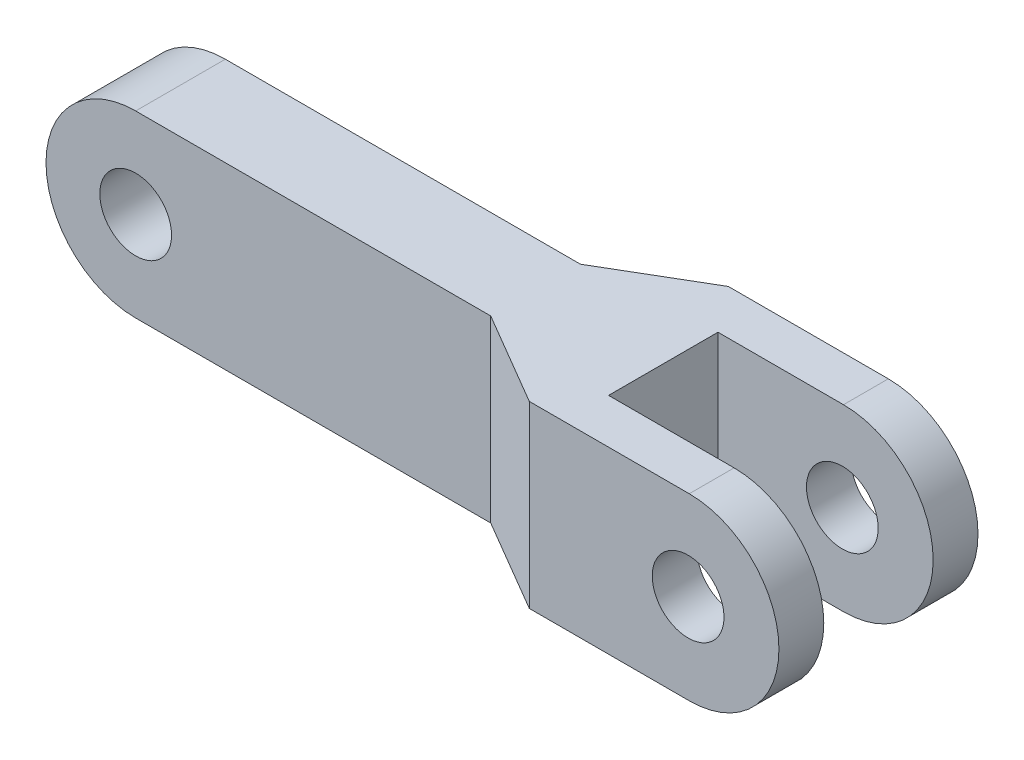
ISO-10303-21;
HEADER;
FILE_DESCRIPTION(('STEP AP214'),'2;1');
FILE_NAME('part.step','',(''),(''),'','','');
FILE_SCHEMA(('AUTOMOTIVE_DESIGN { 1 0 10303 214 1 1 1 1 }'));
ENDSEC;
DATA;
#1=APPLICATION_CONTEXT('core data for automotive mechanical design processes');
#2=APPLICATION_PROTOCOL_DEFINITION('international standard','automotive_design',2000,#1);
#3=PRODUCT_CONTEXT('',#1,'mechanical');
#4=PRODUCT('Part','Part','',(#3));
#5=PRODUCT_RELATED_PRODUCT_CATEGORY('part','',(#4));
#6=PRODUCT_DEFINITION_FORMATION('','',#4);
#7=PRODUCT_DEFINITION_CONTEXT('part definition',#1,'design');
#8=PRODUCT_DEFINITION('design','',#6,#7);
#9=PRODUCT_DEFINITION_SHAPE('','',#8);
#10=(LENGTH_UNIT() NAMED_UNIT(*) SI_UNIT(.MILLI.,.METRE.));
#11=(NAMED_UNIT(*) PLANE_ANGLE_UNIT() SI_UNIT($,.RADIAN.));
#12=(NAMED_UNIT(*) SI_UNIT($,.STERADIAN.) SOLID_ANGLE_UNIT());
#13=UNCERTAINTY_MEASURE_WITH_UNIT(LENGTH_MEASURE(1.E-05),#10,'distance_accuracy_value','');
#14=(GEOMETRIC_REPRESENTATION_CONTEXT(3) GLOBAL_UNCERTAINTY_ASSIGNED_CONTEXT((#13)) GLOBAL_UNIT_ASSIGNED_CONTEXT((#10,
#11,#12)) REPRESENTATION_CONTEXT('',''));
#15=CARTESIAN_POINT('',(0.,0.,0.));
#16=DIRECTION('',(0.,0.,1.));
#17=DIRECTION('',(1.,0.,0.));
#18=AXIS2_PLACEMENT_3D('',#15,#16,#17);
#19=CARTESIAN_POINT('',(18.9206769259007,0.,-0.55));
#20=DIRECTION('',(0.,0.,-1.));
#21=DIRECTION('',(-1.,0.,0.));
#22=AXIS2_PLACEMENT_3D('',#19,#20,#21);
#23=CYLINDRICAL_SURFACE('',#22,5.);
#24=DIRECTION('',(0.,0.,-1.));
#25=VECTOR('',#24,1.);
#26=CARTESIAN_POINT('',(18.9206769259007,5.,0.));
#27=LINE('',#26,#25);
#28=CARTESIAN_POINT('',(18.9206769259007,5.,-0.55));
#29=VERTEX_POINT('',#28);
#30=CARTESIAN_POINT('',(18.9206769259007,5.,-3.05));
#31=VERTEX_POINT('',#30);
#32=EDGE_CURVE('E232',#29,#31,#27,.T.);
#33=ORIENTED_EDGE('',*,*,#32,.F.);
#34=CARTESIAN_POINT('',(18.9206769259007,0.,-0.55));
#35=DIRECTION('',(0.,0.,1.));
#36=DIRECTION('',(1.,0.,0.));
#37=AXIS2_PLACEMENT_3D('',#34,#35,#36);
#38=CIRCLE('',#37,5.);
#39=CARTESIAN_POINT('',(18.9206769259007,-5.,-0.55));
#40=VERTEX_POINT('',#39);
#41=EDGE_CURVE('E49',#40,#29,#38,.T.);
#42=ORIENTED_EDGE('',*,*,#41,.F.);
#43=DIRECTION('',(0.,0.,1.));
#44=VECTOR('',#43,1.);
#45=CARTESIAN_POINT('',(18.9206769259007,-5.,-0.55));
#46=LINE('',#45,#44);
#47=CARTESIAN_POINT('',(18.9206769259007,-5.,-3.05));
#48=VERTEX_POINT('',#47);
#49=EDGE_CURVE('E238',#48,#40,#46,.T.);
#50=ORIENTED_EDGE('',*,*,#49,.F.);
#51=CARTESIAN_POINT('',(18.9206769259007,0.,-3.05));
#52=DIRECTION('',(0.,0.,1.));
#53=DIRECTION('',(1.,0.,0.));
#54=AXIS2_PLACEMENT_3D('',#51,#52,#53);
#55=CIRCLE('',#54,5.);
#56=EDGE_CURVE('E11',#31,#48,#55,.F.);
#57=ORIENTED_EDGE('',*,*,#56,.F.);
#58=EDGE_LOOP('',(#33,#42,#50,#57));
#59=FACE_BOUND('',#58,.T.);
#60=ADVANCED_FACE('F41',(#59),#23,.T.);
#61=CARTESIAN_POINT('',(-15.,0.,5.));
#62=DIRECTION('',(0.,0.,1.));
#63=DIRECTION('',(1.,0.,0.));
#64=AXIS2_PLACEMENT_3D('',#61,#62,#63);
#65=PLANE('',#64);
#66=CARTESIAN_POINT('',(-15.,0.,5.));
#67=DIRECTION('',(0.,0.,1.));
#68=DIRECTION('',(1.,0.,0.));
#69=AXIS2_PLACEMENT_3D('',#66,#67,#68);
#70=CIRCLE('',#69,2.);
#71=CARTESIAN_POINT('',(-13.,0.,5.));
#72=VERTEX_POINT('',#71);
#73=EDGE_CURVE('E187',#72,#72,#70,.T.);
#74=ORIENTED_EDGE('',*,*,#73,.F.);
#75=EDGE_LOOP('',(#74));
#76=FACE_BOUND('',#75,.T.);
#77=DIRECTION('',(1.,0.,0.));
#78=VECTOR('',#77,1.);
#79=CARTESIAN_POINT('',(-15.,-5.,5.));
#80=LINE('',#79,#78);
#81=CARTESIAN_POINT('',(-15.,-5.,5.));
#82=VERTEX_POINT('',#81);
#83=CARTESIAN_POINT('',(4.79902416443997,-5.,5.));
#84=VERTEX_POINT('',#83);
#85=EDGE_CURVE('E196',#82,#84,#80,.T.);
#86=ORIENTED_EDGE('',*,*,#85,.T.);
#87=DIRECTION('',(0.,1.,0.));
#88=VECTOR('',#87,1.);
#89=CARTESIAN_POINT('',(4.79902416443997,-5.,5.));
#90=LINE('',#89,#88);
#91=CARTESIAN_POINT('',(4.79902416443997,5.,5.));
#92=VERTEX_POINT('',#91);
#93=EDGE_CURVE('E157',#84,#92,#90,.T.);
#94=ORIENTED_EDGE('',*,*,#93,.T.);
#95=DIRECTION('',(-1.,0.,0.));
#96=VECTOR('',#95,1.);
#97=CARTESIAN_POINT('',(-15.,5.,5.));
#98=LINE('',#97,#96);
#99=CARTESIAN_POINT('',(-15.,5.,5.));
#100=VERTEX_POINT('',#99);
#101=EDGE_CURVE('E154',#92,#100,#98,.T.);
#102=ORIENTED_EDGE('',*,*,#101,.T.);
#103=CARTESIAN_POINT('',(-15.,0.,5.));
#104=DIRECTION('',(0.,0.,1.));
#105=DIRECTION('',(1.,0.,0.));
#106=AXIS2_PLACEMENT_3D('',#103,#104,#105);
#107=CIRCLE('',#106,5.);
#108=EDGE_CURVE('E193',#100,#82,#107,.T.);
#109=ORIENTED_EDGE('',*,*,#108,.T.);
#110=EDGE_LOOP('',(#86,#94,#102,#109));
#111=FACE_BOUND('',#110,.T.);
#112=ADVANCED_FACE('F269',(#76,#111),#65,.T.);
#113=CARTESIAN_POINT('',(18.9206769259007,0.,5.55));
#114=DIRECTION('',(0.,0.,1.));
#115=DIRECTION('',(1.,0.,0.));
#116=AXIS2_PLACEMENT_3D('',#113,#114,#115);
#117=CYLINDRICAL_SURFACE('',#116,5.);
#118=DIRECTION('',(0.,0.,1.));
#119=VECTOR('',#118,1.);
#120=CARTESIAN_POINT('',(18.9206769259007,-5.,0.));
#121=LINE('',#120,#119);
#122=CARTESIAN_POINT('',(18.9206769259007,-5.,5.55));
#123=VERTEX_POINT('',#122);
#124=CARTESIAN_POINT('',(18.9206769259007,-5.,8.05));
#125=VERTEX_POINT('',#124);
#126=EDGE_CURVE('E222',#123,#125,#121,.T.);
#127=ORIENTED_EDGE('',*,*,#126,.F.);
#128=CARTESIAN_POINT('',(18.9206769259007,0.,5.55));
#129=DIRECTION('',(0.,0.,1.));
#130=DIRECTION('',(1.,0.,0.));
#131=AXIS2_PLACEMENT_3D('',#128,#129,#130);
#132=CIRCLE('',#131,5.);
#133=CARTESIAN_POINT('',(18.9206769259007,5.,5.55));
#134=VERTEX_POINT('',#133);
#135=EDGE_CURVE('E229',#134,#123,#132,.F.);
#136=ORIENTED_EDGE('',*,*,#135,.F.);
#137=DIRECTION('',(0.,0.,-1.));
#138=VECTOR('',#137,1.);
#139=CARTESIAN_POINT('',(18.9206769259007,5.,5.55));
#140=LINE('',#139,#138);
#141=CARTESIAN_POINT('',(18.9206769259007,5.,8.05));
#142=VERTEX_POINT('',#141);
#143=EDGE_CURVE('E227',#142,#134,#140,.T.);
#144=ORIENTED_EDGE('',*,*,#143,.F.);
#145=CARTESIAN_POINT('',(18.9206769259007,0.,8.05));
#146=DIRECTION('',(0.,0.,-1.));
#147=DIRECTION('',(-1.,0.,0.));
#148=AXIS2_PLACEMENT_3D('',#145,#146,#147);
#149=CIRCLE('',#148,5.);
#150=EDGE_CURVE('E134',#125,#142,#149,.F.);
#151=ORIENTED_EDGE('',*,*,#150,.F.);
#152=EDGE_LOOP('',(#127,#136,#144,#151));
#153=FACE_BOUND('',#152,.T.);
#154=ADVANCED_FACE('F271',(#153),#117,.T.);
#155=CARTESIAN_POINT('',(11.9206769259007,-5.,15.7327795740499));
#156=DIRECTION('',(-1.,0.,0.));
#157=DIRECTION('',(0.,0.,1.));
#158=AXIS2_PLACEMENT_3D('',#155,#156,#157);
#159=PLANE('',#158);
#160=DIRECTION('',(0.,1.,0.));
#161=VECTOR('',#160,1.);
#162=CARTESIAN_POINT('',(11.9206769259007,-5.,5.55));
#163=LINE('',#162,#161);
#164=CARTESIAN_POINT('',(11.9206769259007,-5.,5.55));
#165=VERTEX_POINT('',#164);
#166=CARTESIAN_POINT('',(11.9206769259007,5.,5.55));
#167=VERTEX_POINT('',#166);
#168=EDGE_CURVE('E175',#165,#167,#163,.T.);
#169=ORIENTED_EDGE('',*,*,#168,.F.);
#170=DIRECTION('',(0.,0.,-1.));
#171=VECTOR('',#170,1.);
#172=CARTESIAN_POINT('',(11.9206769259007,-5.,15.7327795740499));
#173=LINE('',#172,#171);
#174=CARTESIAN_POINT('',(11.9206769259007,-5.,-0.55));
#175=VERTEX_POINT('',#174);
#176=EDGE_CURVE('E184',#165,#175,#173,.T.);
#177=ORIENTED_EDGE('',*,*,#176,.T.);
#178=DIRECTION('',(0.,1.,0.));
#179=VECTOR('',#178,1.);
#180=CARTESIAN_POINT('',(11.9206769259007,-5.,-0.55));
#181=LINE('',#180,#179);
#182=CARTESIAN_POINT('',(11.9206769259007,5.,-0.55));
#183=VERTEX_POINT('',#182);
#184=EDGE_CURVE('E180',#175,#183,#181,.T.);
#185=ORIENTED_EDGE('',*,*,#184,.T.);
#186=DIRECTION('',(0.,0.,-1.));
#187=VECTOR('',#186,1.);
#188=CARTESIAN_POINT('',(11.9206769259007,5.,15.7327795740499));
#189=LINE('',#188,#187);
#190=EDGE_CURVE('E148',#167,#183,#189,.T.);
#191=ORIENTED_EDGE('',*,*,#190,.F.);
#192=EDGE_LOOP('',(#169,#177,#185,#191));
#193=FACE_BOUND('',#192,.T.);
#194=ADVANCED_FACE('F249',(#193),#159,.F.);
#195=CARTESIAN_POINT('',(0.,-5.,-0.55));
#196=DIRECTION('',(0.,0.,1.));
#197=DIRECTION('',(1.,0.,0.));
#198=AXIS2_PLACEMENT_3D('',#195,#196,#197);
#199=PLANE('',#198);
#200=CARTESIAN_POINT('',(18.8560763917247,0.,-0.55));
#201=DIRECTION('',(0.,0.,1.));
#202=DIRECTION('',(1.,0.,0.));
#203=AXIS2_PLACEMENT_3D('',#200,#201,#202);
#204=CIRCLE('',#203,2.);
#205=CARTESIAN_POINT('',(20.8560763917247,0.,-0.55));
#206=VERTEX_POINT('',#205);
#207=EDGE_CURVE('E155',#206,#206,#204,.T.);
#208=ORIENTED_EDGE('',*,*,#207,.F.);
#209=EDGE_LOOP('',(#208));
#210=FACE_BOUND('',#209,.T.);
#211=DIRECTION('',(1.,0.,0.));
#212=VECTOR('',#211,1.);
#213=CARTESIAN_POINT('',(0.,-5.,-0.55));
#214=LINE('',#213,#212);
#215=EDGE_CURVE('E215',#175,#40,#214,.T.);
#216=ORIENTED_EDGE('',*,*,#215,.T.);
#217=ORIENTED_EDGE('',*,*,#41,.T.);
#218=DIRECTION('',(1.,0.,0.));
#219=VECTOR('',#218,1.);
#220=CARTESIAN_POINT('',(0.,5.,-0.55));
#221=LINE('',#220,#219);
#222=EDGE_CURVE('E214',#183,#29,#221,.T.);
#223=ORIENTED_EDGE('',*,*,#222,.F.);
#224=ORIENTED_EDGE('',*,*,#184,.F.);
#225=EDGE_LOOP('',(#216,#217,#223,#224));
#226=FACE_BOUND('',#225,.T.);
#227=ADVANCED_FACE('F241',(#210,#226),#199,.T.);
#228=CARTESIAN_POINT('',(0.,-5.,-3.05));
#229=DIRECTION('',(0.,0.,1.));
#230=DIRECTION('',(1.,0.,0.));
#231=AXIS2_PLACEMENT_3D('',#228,#229,#230);
#232=PLANE('',#231);
#233=CARTESIAN_POINT('',(18.8560763917247,0.,-3.05));
#234=DIRECTION('',(0.,0.,-1.));
#235=DIRECTION('',(-1.,0.,0.));
#236=AXIS2_PLACEMENT_3D('',#233,#234,#235);
#237=CIRCLE('',#236,2.);
#238=CARTESIAN_POINT('',(16.8560763917247,0.,-3.05));
#239=VERTEX_POINT('',#238);
#240=EDGE_CURVE('E314',#239,#239,#237,.T.);
#241=ORIENTED_EDGE('',*,*,#240,.F.);
#242=EDGE_LOOP('',(#241));
#243=FACE_BOUND('',#242,.T.);
#244=DIRECTION('',(1.,0.,0.));
#245=VECTOR('',#244,1.);
#246=CARTESIAN_POINT('',(0.,5.,-3.05));
#247=LINE('',#246,#245);
#248=CARTESIAN_POINT('',(10.,5.,-3.05));
#249=VERTEX_POINT('',#248);
#250=EDGE_CURVE('E219',#249,#31,#247,.T.);
#251=ORIENTED_EDGE('',*,*,#250,.T.);
#252=ORIENTED_EDGE('',*,*,#56,.T.);
#253=DIRECTION('',(1.,0.,0.));
#254=VECTOR('',#253,1.);
#255=CARTESIAN_POINT('',(0.,-5.,-3.05));
#256=LINE('',#255,#254);
#257=CARTESIAN_POINT('',(10.,-5.,-3.05));
#258=VERTEX_POINT('',#257);
#259=EDGE_CURVE('E218',#258,#48,#256,.T.);
#260=ORIENTED_EDGE('',*,*,#259,.F.);
#261=DIRECTION('',(0.,-1.,0.));
#262=VECTOR('',#261,1.);
#263=CARTESIAN_POINT('',(10.,5.,-3.05));
#264=LINE('',#263,#262);
#265=EDGE_CURVE('E212',#249,#258,#264,.T.);
#266=ORIENTED_EDGE('',*,*,#265,.F.);
#267=EDGE_LOOP('',(#251,#252,#260,#266));
#268=FACE_BOUND('',#267,.T.);
#269=ADVANCED_FACE('F255',(#243,#268),#232,.F.);
#270=CARTESIAN_POINT('',(0.,-5.,0.));
#271=DIRECTION('',(0.,1.,0.));
#272=DIRECTION('',(0.,0.,1.));
#273=AXIS2_PLACEMENT_3D('',#270,#271,#272);
#274=PLANE('',#273);
#275=ORIENTED_EDGE('',*,*,#259,.T.);
#276=ORIENTED_EDGE('',*,*,#49,.T.);
#277=ORIENTED_EDGE('',*,*,#215,.F.);
#278=ORIENTED_EDGE('',*,*,#176,.F.);
#279=DIRECTION('',(1.,0.,0.));
#280=VECTOR('',#279,1.);
#281=CARTESIAN_POINT('',(0.,-5.,5.55));
#282=LINE('',#281,#280);
#283=EDGE_CURVE('E172',#165,#123,#282,.T.);
#284=ORIENTED_EDGE('',*,*,#283,.T.);
#285=ORIENTED_EDGE('',*,*,#126,.T.);
#286=DIRECTION('',(1.,0.,0.));
#287=VECTOR('',#286,1.);
#288=CARTESIAN_POINT('',(-0.30776406404415,-5.,8.05));
#289=LINE('',#288,#287);
#290=CARTESIAN_POINT('',(10.,-5.,8.05));
#291=VERTEX_POINT('',#290);
#292=EDGE_CURVE('E139',#291,#125,#289,.T.);
#293=ORIENTED_EDGE('',*,*,#292,.F.);
#294=DIRECTION('',(-0.86261459231953,0.,-0.505861705525741));
#295=VECTOR('',#294,1.);
#296=CARTESIAN_POINT('',(-0.953767044327186,-5.,1.62639978698335));
#297=LINE('',#296,#295);
#298=EDGE_CURVE('E147',#291,#84,#297,.T.);
#299=ORIENTED_EDGE('',*,*,#298,.T.);
#300=ORIENTED_EDGE('',*,*,#85,.F.);
#301=DIRECTION('',(0.,0.,-1.));
#302=VECTOR('',#301,1.);
#303=CARTESIAN_POINT('',(-15.,-5.,5.));
#304=LINE('',#303,#302);
#305=CARTESIAN_POINT('',(-15.,-5.,0.));
#306=VERTEX_POINT('',#305);
#307=EDGE_CURVE('E209',#82,#306,#304,.T.);
#308=ORIENTED_EDGE('',*,*,#307,.T.);
#309=DIRECTION('',(1.,0.,0.));
#310=VECTOR('',#309,1.);
#311=CARTESIAN_POINT('',(-15.,-5.,0.));
#312=LINE('',#311,#310);
#313=CARTESIAN_POINT('',(4.79902416443997,-5.,0.));
#314=VERTEX_POINT('',#313);
#315=EDGE_CURVE('E203',#306,#314,#312,.T.);
#316=ORIENTED_EDGE('',*,*,#315,.T.);
#317=DIRECTION('',(-0.86261459231953,0.,0.505861705525741));
#318=VECTOR('',#317,1.);
#319=CARTESIAN_POINT('',(1.22805140008356,-5.,2.0941198874296));
#320=LINE('',#319,#318);
#321=EDGE_CURVE('E165',#258,#314,#320,.T.);
#322=ORIENTED_EDGE('',*,*,#321,.F.);
#323=EDGE_LOOP('',(#275,#276,#277,#278,#284,#285,#293,#299,#300,#308,#316,#322));
#324=FACE_BOUND('',#323,.T.);
#325=ADVANCED_FACE('F252',(#324),#274,.F.);
#326=CARTESIAN_POINT('',(0.,5.,0.));
#327=DIRECTION('',(0.,1.,0.));
#328=DIRECTION('',(0.,0.,1.));
#329=AXIS2_PLACEMENT_3D('',#326,#327,#328);
#330=PLANE('',#329);
#331=ORIENTED_EDGE('',*,*,#222,.T.);
#332=ORIENTED_EDGE('',*,*,#32,.T.);
#333=ORIENTED_EDGE('',*,*,#250,.F.);
#334=DIRECTION('',(-0.86261459231953,0.,0.505861705525741));
#335=VECTOR('',#334,1.);
#336=CARTESIAN_POINT('',(1.22805140008356,5.,2.0941198874296));
#337=LINE('',#336,#335);
#338=CARTESIAN_POINT('',(4.79902416443997,5.,0.));
#339=VERTEX_POINT('',#338);
#340=EDGE_CURVE('E164',#249,#339,#337,.T.);
#341=ORIENTED_EDGE('',*,*,#340,.T.);
#342=DIRECTION('',(-1.,0.,0.));
#343=VECTOR('',#342,1.);
#344=CARTESIAN_POINT('',(-15.,5.,0.));
#345=LINE('',#344,#343);
#346=CARTESIAN_POINT('',(-15.,5.,0.));
#347=VERTEX_POINT('',#346);
#348=EDGE_CURVE('E197',#339,#347,#345,.T.);
#349=ORIENTED_EDGE('',*,*,#348,.T.);
#350=DIRECTION('',(0.,0.,-1.));
#351=VECTOR('',#350,1.);
#352=CARTESIAN_POINT('',(-15.,5.,5.));
#353=LINE('',#352,#351);
#354=EDGE_CURVE('E200',#100,#347,#353,.T.);
#355=ORIENTED_EDGE('',*,*,#354,.F.);
#356=ORIENTED_EDGE('',*,*,#101,.F.);
#357=DIRECTION('',(-0.86261459231953,0.,-0.505861705525741));
#358=VECTOR('',#357,1.);
#359=CARTESIAN_POINT('',(-0.953767044327186,5.,1.62639978698335));
#360=LINE('',#359,#358);
#361=CARTESIAN_POINT('',(10.,5.,8.05));
#362=VERTEX_POINT('',#361);
#363=EDGE_CURVE('E145',#362,#92,#360,.T.);
#364=ORIENTED_EDGE('',*,*,#363,.F.);
#365=DIRECTION('',(1.,0.,0.));
#366=VECTOR('',#365,1.);
#367=CARTESIAN_POINT('',(-0.30776406404415,5.,8.05));
#368=LINE('',#367,#366);
#369=EDGE_CURVE('E128',#362,#142,#368,.T.);
#370=ORIENTED_EDGE('',*,*,#369,.T.);
#371=ORIENTED_EDGE('',*,*,#143,.T.);
#372=DIRECTION('',(1.,0.,0.));
#373=VECTOR('',#372,1.);
#374=CARTESIAN_POINT('',(0.,5.,5.55));
#375=LINE('',#374,#373);
#376=EDGE_CURVE('E171',#167,#134,#375,.T.);
#377=ORIENTED_EDGE('',*,*,#376,.F.);
#378=ORIENTED_EDGE('',*,*,#190,.T.);
#379=EDGE_LOOP('',(#331,#332,#333,#341,#349,#355,#356,#364,#370,#371,#377,#378));
#380=FACE_BOUND('',#379,.T.);
#381=ADVANCED_FACE('F152',(#380),#330,.T.);
#382=CARTESIAN_POINT('',(-15.,0.,0.));
#383=DIRECTION('',(0.,0.,1.));
#384=DIRECTION('',(1.,0.,0.));
#385=AXIS2_PLACEMENT_3D('',#382,#383,#384);
#386=PLANE('',#385);
#387=ORIENTED_EDGE('',*,*,#348,.F.);
#388=DIRECTION('',(0.,1.,0.));
#389=VECTOR('',#388,1.);
#390=CARTESIAN_POINT('',(4.79902416443997,-5.,0.));
#391=LINE('',#390,#389);
#392=EDGE_CURVE('E167',#314,#339,#391,.T.);
#393=ORIENTED_EDGE('',*,*,#392,.F.);
#394=ORIENTED_EDGE('',*,*,#315,.F.);
#395=CARTESIAN_POINT('',(-15.,0.,0.));
#396=DIRECTION('',(0.,0.,1.));
#397=DIRECTION('',(1.,0.,0.));
#398=AXIS2_PLACEMENT_3D('',#395,#396,#397);
#399=CIRCLE('',#398,5.);
#400=EDGE_CURVE('E190',#347,#306,#399,.T.);
#401=ORIENTED_EDGE('',*,*,#400,.F.);
#402=EDGE_LOOP('',(#387,#393,#394,#401));
#403=FACE_BOUND('',#402,.T.);
#404=CARTESIAN_POINT('',(-15.,0.,0.));
#405=DIRECTION('',(0.,0.,1.));
#406=DIRECTION('',(1.,0.,0.));
#407=AXIS2_PLACEMENT_3D('',#404,#405,#406);
#408=CIRCLE('',#407,2.);
#409=CARTESIAN_POINT('',(-13.,0.,0.));
#410=VERTEX_POINT('',#409);
#411=EDGE_CURVE('E183',#410,#410,#408,.T.);
#412=ORIENTED_EDGE('',*,*,#411,.T.);
#413=EDGE_LOOP('',(#412));
#414=FACE_BOUND('',#413,.T.);
#415=ADVANCED_FACE('F266',(#403,#414),#386,.F.);
#416=CARTESIAN_POINT('',(-15.,0.,5.));
#417=DIRECTION('',(0.,0.,-1.));
#418=DIRECTION('',(-1.,0.,0.));
#419=AXIS2_PLACEMENT_3D('',#416,#417,#418);
#420=CYLINDRICAL_SURFACE('',#419,5.);
#421=ORIENTED_EDGE('',*,*,#400,.T.);
#422=ORIENTED_EDGE('',*,*,#307,.F.);
#423=ORIENTED_EDGE('',*,*,#108,.F.);
#424=ORIENTED_EDGE('',*,*,#354,.T.);
#425=EDGE_LOOP('',(#421,#422,#423,#424));
#426=FACE_BOUND('',#425,.T.);
#427=ADVANCED_FACE('F264',(#426),#420,.T.);
#428=CARTESIAN_POINT('',(-15.,0.,5.));
#429=DIRECTION('',(0.,0.,-1.));
#430=DIRECTION('',(-1.,0.,0.));
#431=AXIS2_PLACEMENT_3D('',#428,#429,#430);
#432=CYLINDRICAL_SURFACE('',#431,2.);
#433=ORIENTED_EDGE('',*,*,#73,.T.);
#434=EDGE_LOOP('',(#433));
#435=FACE_BOUND('',#434,.T.);
#436=ORIENTED_EDGE('',*,*,#411,.F.);
#437=EDGE_LOOP('',(#436));
#438=FACE_BOUND('',#437,.T.);
#439=ADVANCED_FACE('F282',(#435,#438),#432,.F.);
#440=CARTESIAN_POINT('',(-0.30776406404415,-5.,8.05));
#441=DIRECTION('',(0.,0.,-1.));
#442=DIRECTION('',(-1.,0.,0.));
#443=AXIS2_PLACEMENT_3D('',#440,#441,#442);
#444=PLANE('',#443);
#445=CARTESIAN_POINT('',(18.8560763917247,0.,8.05));
#446=DIRECTION('',(0.,0.,-1.));
#447=DIRECTION('',(-1.,0.,0.));
#448=AXIS2_PLACEMENT_3D('',#445,#446,#447);
#449=CIRCLE('',#448,2.);
#450=CARTESIAN_POINT('',(16.8560763917247,0.,8.05));
#451=VERTEX_POINT('',#450);
#452=EDGE_CURVE('E235',#451,#451,#449,.T.);
#453=ORIENTED_EDGE('',*,*,#452,.T.);
#454=EDGE_LOOP('',(#453));
#455=FACE_BOUND('',#454,.T.);
#456=ORIENTED_EDGE('',*,*,#292,.T.);
#457=ORIENTED_EDGE('',*,*,#150,.T.);
#458=ORIENTED_EDGE('',*,*,#369,.F.);
#459=DIRECTION('',(0.,1.,0.));
#460=VECTOR('',#459,1.);
#461=CARTESIAN_POINT('',(10.,-5.,8.05));
#462=LINE('',#461,#460);
#463=EDGE_CURVE('E132',#291,#362,#462,.T.);
#464=ORIENTED_EDGE('',*,*,#463,.F.);
#465=EDGE_LOOP('',(#456,#457,#458,#464));
#466=FACE_BOUND('',#465,.T.);
#467=ADVANCED_FACE('F131',(#455,#466),#444,.F.);
#468=CARTESIAN_POINT('',(0.,-5.,5.55));
#469=DIRECTION('',(0.,0.,1.));
#470=DIRECTION('',(1.,0.,0.));
#471=AXIS2_PLACEMENT_3D('',#468,#469,#470);
#472=PLANE('',#471);
#473=CARTESIAN_POINT('',(18.8560763917247,0.,5.55));
#474=DIRECTION('',(0.,0.,1.));
#475=DIRECTION('',(1.,0.,0.));
#476=AXIS2_PLACEMENT_3D('',#473,#474,#475);
#477=CIRCLE('',#476,2.);
#478=CARTESIAN_POINT('',(20.8560763917247,0.,5.55));
#479=VERTEX_POINT('',#478);
#480=EDGE_CURVE('E160',#479,#479,#477,.T.);
#481=ORIENTED_EDGE('',*,*,#480,.T.);
#482=EDGE_LOOP('',(#481));
#483=FACE_BOUND('',#482,.T.);
#484=ORIENTED_EDGE('',*,*,#376,.T.);
#485=ORIENTED_EDGE('',*,*,#135,.T.);
#486=ORIENTED_EDGE('',*,*,#283,.F.);
#487=ORIENTED_EDGE('',*,*,#168,.T.);
#488=EDGE_LOOP('',(#484,#485,#486,#487));
#489=FACE_BOUND('',#488,.T.);
#490=ADVANCED_FACE('F325',(#483,#489),#472,.F.);
#491=CARTESIAN_POINT('',(1.22805140008356,-5.,2.0941198874296));
#492=DIRECTION('',(-0.505861705525741,0.,-0.86261459231953));
#493=DIRECTION('',(-0.86261459231953,0.,0.505861705525741));
#494=AXIS2_PLACEMENT_3D('',#491,#492,#493);
#495=PLANE('',#494);
#496=ORIENTED_EDGE('',*,*,#340,.F.);
#497=ORIENTED_EDGE('',*,*,#265,.T.);
#498=ORIENTED_EDGE('',*,*,#321,.T.);
#499=ORIENTED_EDGE('',*,*,#392,.T.);
#500=EDGE_LOOP('',(#496,#497,#498,#499));
#501=FACE_BOUND('',#500,.T.);
#502=ADVANCED_FACE('F257',(#501),#495,.T.);
#503=CARTESIAN_POINT('',(-0.953767044327186,-5.,1.62639978698335));
#504=DIRECTION('',(0.505861705525741,0.,-0.86261459231953));
#505=DIRECTION('',(-0.86261459231953,0.,-0.505861705525741));
#506=AXIS2_PLACEMENT_3D('',#503,#504,#505);
#507=PLANE('',#506);
#508=ORIENTED_EDGE('',*,*,#363,.T.);
#509=ORIENTED_EDGE('',*,*,#93,.F.);
#510=ORIENTED_EDGE('',*,*,#298,.F.);
#511=ORIENTED_EDGE('',*,*,#463,.T.);
#512=EDGE_LOOP('',(#508,#509,#510,#511));
#513=FACE_BOUND('',#512,.T.);
#514=ADVANCED_FACE('F143',(#513),#507,.F.);
#515=CARTESIAN_POINT('',(18.8560763917247,0.,8.05));
#516=DIRECTION('',(0.,0.,-1.));
#517=DIRECTION('',(-1.,0.,0.));
#518=AXIS2_PLACEMENT_3D('',#515,#516,#517);
#519=CYLINDRICAL_SURFACE('',#518,2.);
#520=ORIENTED_EDGE('',*,*,#452,.F.);
#521=EDGE_LOOP('',(#520));
#522=FACE_BOUND('',#521,.T.);
#523=ORIENTED_EDGE('',*,*,#480,.F.);
#524=EDGE_LOOP('',(#523));
#525=FACE_BOUND('',#524,.T.);
#526=ADVANCED_FACE('F310',(#522,#525),#519,.F.);
#527=ORIENTED_EDGE('',*,*,#207,.T.);
#528=EDGE_LOOP('',(#527));
#529=FACE_BOUND('',#528,.T.);
#530=ORIENTED_EDGE('',*,*,#240,.T.);
#531=EDGE_LOOP('',(#530));
#532=FACE_BOUND('',#531,.T.);
#533=ADVANCED_FACE('F307',(#529,#532),#519,.F.);
#534=CLOSED_SHELL('',(#60,#112,#154,#194,#227,#269,#325,#381,#415,#427,#439,#467,#490,#502,#514,
#526,#533));
#535=MANIFOLD_SOLID_BREP('B2',#534);
#536=ADVANCED_BREP_SHAPE_REPRESENTATION('',(#18,#535),#14);
#537=SHAPE_DEFINITION_REPRESENTATION(#9,#536);
ENDSEC;
END-ISO-10303-21;
